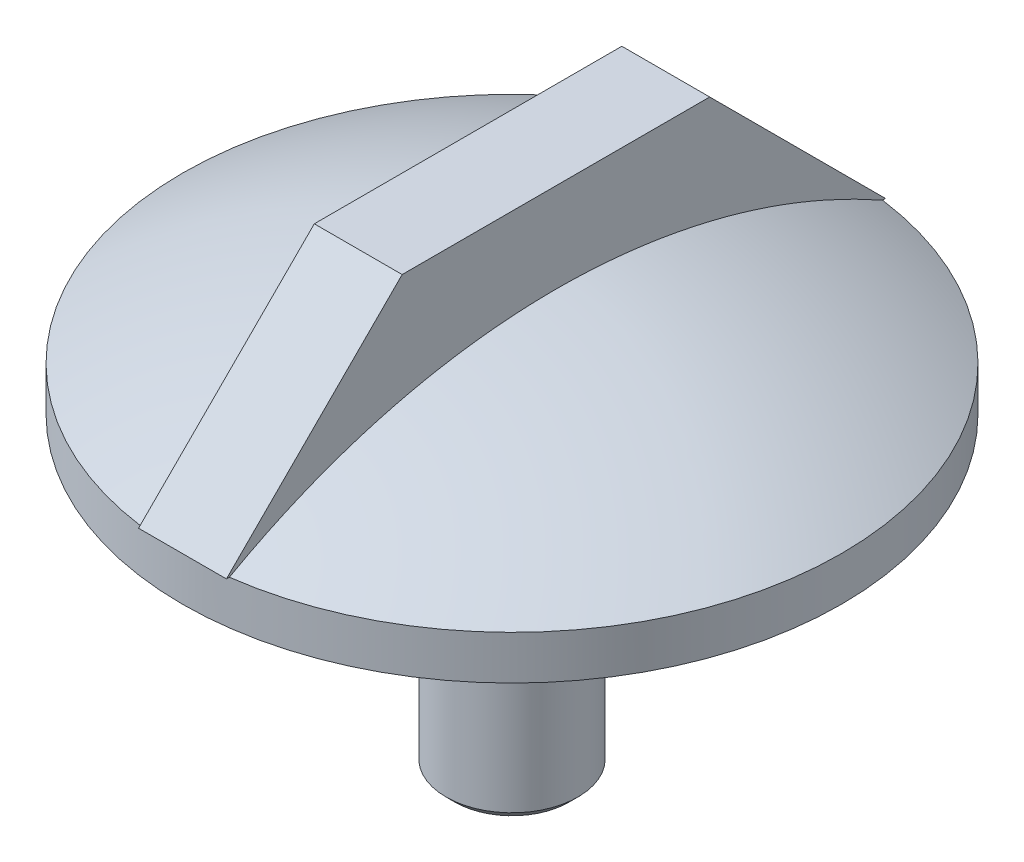
ISO-10303-21;
HEADER;
FILE_DESCRIPTION(('STEP AP214'),'2;1');
FILE_NAME('part.step','',(''),(''),'','','');
FILE_SCHEMA(('AUTOMOTIVE_DESIGN { 1 0 10303 214 1 1 1 1 }'));
ENDSEC;
DATA;
#1=APPLICATION_CONTEXT('core data for automotive mechanical design processes');
#2=APPLICATION_PROTOCOL_DEFINITION('international standard','automotive_design',2000,#1);
#3=PRODUCT_CONTEXT('',#1,'mechanical');
#4=PRODUCT('Part','Part','',(#3));
#5=PRODUCT_RELATED_PRODUCT_CATEGORY('part','',(#4));
#6=PRODUCT_DEFINITION_FORMATION('','',#4);
#7=PRODUCT_DEFINITION_CONTEXT('part definition',#1,'design');
#8=PRODUCT_DEFINITION('design','',#6,#7);
#9=PRODUCT_DEFINITION_SHAPE('','',#8);
#10=(LENGTH_UNIT() NAMED_UNIT(*) SI_UNIT(.MILLI.,.METRE.));
#11=(NAMED_UNIT(*) PLANE_ANGLE_UNIT() SI_UNIT($,.RADIAN.));
#12=(NAMED_UNIT(*) SI_UNIT($,.STERADIAN.) SOLID_ANGLE_UNIT());
#13=UNCERTAINTY_MEASURE_WITH_UNIT(LENGTH_MEASURE(1.E-05),#10,'distance_accuracy_value','');
#14=(GEOMETRIC_REPRESENTATION_CONTEXT(3) GLOBAL_UNCERTAINTY_ASSIGNED_CONTEXT((#13)) GLOBAL_UNIT_ASSIGNED_CONTEXT((#10,
#11,#12)) REPRESENTATION_CONTEXT('',''));
#15=CARTESIAN_POINT('',(0.,0.,0.));
#16=DIRECTION('',(0.,0.,1.));
#17=DIRECTION('',(1.,0.,0.));
#18=AXIS2_PLACEMENT_3D('',#15,#16,#17);
#19=CARTESIAN_POINT('',(7.49999999999998,1.,0.));
#20=CARTESIAN_POINT('',(4.01502537335899,2.96753451753274,-1.11022302462516E-13));
#21=CARTESIAN_POINT('',(0.,3.,0.));
#22=B_SPLINE_CURVE_WITH_KNOTS('',2,(#19,#20,#21),.UNSPECIFIED.,.F.,.F.,(3,3),(0.,1.),.UNSPECIFIED.);
#23=CARTESIAN_POINT('',(0.,1.,0.));
#24=DIRECTION('',(0.,-1.,0.));
#25=AXIS1_PLACEMENT('',#23,#24);
#26=SURFACE_OF_REVOLUTION('',#22,#25);
#27=CARTESIAN_POINT('',(0.,1.,0.));
#28=DIRECTION('',(0.,1.,0.));
#29=DIRECTION('',(0.,0.,0.999999999999999));
#30=AXIS2_PLACEMENT_3D('',#27,#28,#29);
#31=CIRCLE('',#30,7.5);
#32=CARTESIAN_POINT('',(1.,1.,7.43303437365922));
#33=VERTEX_POINT('',#32);
#34=CARTESIAN_POINT('',(1.,1.,-7.43303437365933));
#35=VERTEX_POINT('',#34);
#36=EDGE_CURVE('E216',#33,#35,#31,.T.);
#37=ORIENTED_EDGE('',*,*,#36,.T.);
#38=CARTESIAN_POINT('',(1.,1.,-7.43303437365933));
#39=CARTESIAN_POINT('',(1.,1.12483932836674,-7.20995735723141));
#40=CARTESIAN_POINT('',(1.,1.24444428124756,-6.98393308758568));
#41=CARTESIAN_POINT('',(1.,1.47262415679961,-6.5263844530835));
#42=CARTESIAN_POINT('',(1.,1.58119898909355,-6.29486004317985));
#43=CARTESIAN_POINT('',(1.,1.78693917127141,-5.82629039901203));
#44=CARTESIAN_POINT('',(1.,1.88408375968663,-5.58923602803384));
#45=CARTESIAN_POINT('',(1.,2.0662791962518,-5.11052230813791));
#46=CARTESIAN_POINT('',(1.,2.15132941996455,-4.86886272218091));
#47=CARTESIAN_POINT('',(1.,2.3510061882268,-4.25152040223825));
#48=CARTESIAN_POINT('',(1.,2.45722353910996,-3.87307950893212));
#49=CARTESIAN_POINT('',(1.,2.63960187549855,-3.10892602747556));
#50=CARTESIAN_POINT('',(1.,2.71575297634149,-2.72321109148539));
#51=CARTESIAN_POINT('',(1.,2.83791386529063,-1.94699714541732));
#52=CARTESIAN_POINT('',(1.,2.88391935522713,-1.55649746121097));
#53=CARTESIAN_POINT('',(1.,2.94579054653531,-0.773157140391238));
#54=CARTESIAN_POINT('',(1.,2.96166248652454,-0.380317005224834));
#55=CARTESIAN_POINT('',(1.,2.96099274938101,0.405380721330795));
#56=CARTESIAN_POINT('',(1.,2.94444728502722,0.79823830939718));
#57=CARTESIAN_POINT('',(1.,2.88126057539498,1.58156634689101));
#58=CARTESIAN_POINT('',(1.00000000000001,2.83461307980654,1.97203628355114));
#59=CARTESIAN_POINT('',(0.999999999999996,2.71114919949951,2.74813484363986));
#60=CARTESIAN_POINT('',(0.999999999999983,2.63433727736462,3.13376417449233));
#61=CARTESIAN_POINT('',(1.00000000000002,2.4506418890203,3.89769219731147));
#62=CARTESIAN_POINT('',(1.00000000000007,2.34376838861548,4.27599327434062));
#63=CARTESIAN_POINT('',(1.00000000000005,2.1436892899011,4.8910106566817));
#64=CARTESIAN_POINT('',(1.00000000000001,2.0589922496674,5.13053430523275));
#65=CARTESIAN_POINT('',(0.999999999999988,1.87771398030631,5.60503916543916));
#66=CARTESIAN_POINT('',(0.999999999999997,1.78113337350886,5.84002061421968));
#67=CARTESIAN_POINT('',(1.,1.57672278774387,6.30452183507819));
#68=CARTESIAN_POINT('',(1.,1.46891338652087,6.53405068318347));
#69=CARTESIAN_POINT('',(0.999999999999999,1.2424516731923,6.98769706953818));
#70=CARTESIAN_POINT('',(0.999999999999997,1.12379941222688,7.21181463330354));
#71=CARTESIAN_POINT('',(1.,1.,7.43303437365922));
#72=B_SPLINE_CURVE_WITH_KNOTS('',3,(#38,#39,#40,#41,#42,#43,#44,#45,#46,#47,#48,#49,#50,#51,#52,
#53,#54,#55,#56,#57,#58,#59,#60,#61,#62,#63,#64,#65,#66,#67,#68,#69,#70,#71),.UNSPECIFIED.,.F.,
.F.,(4,2,2,2,2,2,2,2,2,2,2,2,2,2,2,2,4),(0.,0.766851037742644,1.53370835831071,2.30193774318379,
3.07020677767693,4.24810829910486,5.42639674883922,6.60485316273854,7.78306557150267,
8.96141563523786,10.1400104473741,11.318430961558,12.4964612734932,13.2583433361264,
14.0201855167623,14.7806553334595,15.5411215635997),.UNSPECIFIED.);
#73=EDGE_CURVE('E172',#35,#33,#72,.T.);
#74=ORIENTED_EDGE('',*,*,#73,.T.);
#75=EDGE_LOOP('',(#37,#74));
#76=FACE_BOUND('',#75,.T.);
#77=ADVANCED_FACE('F44',(#76),#26,.F.);
#78=CARTESIAN_POINT('',(0.,1.,0.));
#79=DIRECTION('',(0.,-1.,0.));
#80=DIRECTION('',(0.,0.,-0.999999999999999));
#81=AXIS2_PLACEMENT_3D('',#78,#79,#80);
#82=CYLINDRICAL_SURFACE('',#81,7.5);
#83=CARTESIAN_POINT('',(0.,1.,7.50000000000001));
#84=VERTEX_POINT('',#83);
#85=EDGE_CURVE('E116',#84,#33,#31,.T.);
#86=ORIENTED_EDGE('',*,*,#85,.F.);
#87=CARTESIAN_POINT('',(-0.999999999999945,1.,7.43303437365916));
#88=VERTEX_POINT('',#87);
#89=EDGE_CURVE('E68',#88,#84,#31,.T.);
#90=ORIENTED_EDGE('',*,*,#89,.F.);
#91=CARTESIAN_POINT('',(-0.999999999999945,1.,-7.43303437365928));
#92=VERTEX_POINT('',#91);
#93=EDGE_CURVE('E222',#92,#88,#31,.T.);
#94=ORIENTED_EDGE('',*,*,#93,.F.);
#95=CARTESIAN_POINT('',(0.,1.,-7.50000000000001));
#96=VERTEX_POINT('',#95);
#97=EDGE_CURVE('E219',#96,#92,#31,.T.);
#98=ORIENTED_EDGE('',*,*,#97,.F.);
#99=EDGE_CURVE('E218',#35,#96,#31,.T.);
#100=ORIENTED_EDGE('',*,*,#99,.F.);
#101=ORIENTED_EDGE('',*,*,#36,.F.);
#102=EDGE_LOOP('',(#86,#90,#94,#98,#100,#101));
#103=FACE_BOUND('',#102,.T.);
#104=CARTESIAN_POINT('',(0.,0.,0.));
#105=DIRECTION('',(0.,1.,0.));
#106=DIRECTION('',(0.,0.,0.999999999999999));
#107=AXIS2_PLACEMENT_3D('',#104,#105,#106);
#108=CIRCLE('',#107,7.5);
#109=CARTESIAN_POINT('',(0.,0.,7.49999999999999));
#110=VERTEX_POINT('',#109);
#111=EDGE_CURVE('E145',#110,#110,#108,.T.);
#112=ORIENTED_EDGE('',*,*,#111,.T.);
#113=EDGE_LOOP('',(#112));
#114=FACE_BOUND('',#113,.T.);
#115=ADVANCED_FACE('F208',(#103,#114),#82,.T.);
#116=CARTESIAN_POINT('',(0.,0.,0.));
#117=DIRECTION('',(0.,1.,0.));
#118=DIRECTION('',(0.,0.,0.999999999999999));
#119=AXIS2_PLACEMENT_3D('',#116,#117,#118);
#120=PLANE('',#119);
#121=CARTESIAN_POINT('',(0.,0.,0.));
#122=DIRECTION('',(0.,-1.,0.));
#123=DIRECTION('',(0.,0.,-0.999999999999999));
#124=AXIS2_PLACEMENT_3D('',#121,#122,#123);
#125=CIRCLE('',#124,1.5);
#126=CARTESIAN_POINT('',(0.,0.,1.5));
#127=VERTEX_POINT('',#126);
#128=EDGE_CURVE('E129',#127,#127,#125,.T.);
#129=ORIENTED_EDGE('',*,*,#128,.F.);
#130=EDGE_LOOP('',(#129));
#131=FACE_BOUND('',#130,.T.);
#132=ORIENTED_EDGE('',*,*,#111,.F.);
#133=EDGE_LOOP('',(#132));
#134=FACE_BOUND('',#133,.T.);
#135=ADVANCED_FACE('F167',(#131,#134),#120,.F.);
#136=CARTESIAN_POINT('',(-0.999999999999945,1.,-7.43303437365928));
#137=CARTESIAN_POINT('',(-0.999999999999981,1.12483932836676,-7.20995735723136));
#138=CARTESIAN_POINT('',(-0.999999999999995,1.24444428124759,-6.98393308758562));
#139=CARTESIAN_POINT('',(-1.00000000000001,1.47262415679964,-6.52638445308344));
#140=CARTESIAN_POINT('',(-1.,1.58119898909358,-6.29486004317978));
#141=CARTESIAN_POINT('',(-0.999999999999999,1.78693917127144,-5.82629039901196));
#142=CARTESIAN_POINT('',(-1.,1.88408375968667,-5.58923602803376));
#143=CARTESIAN_POINT('',(-1.,2.06627919625182,-5.11052230813782));
#144=CARTESIAN_POINT('',(-1.,2.15132941996456,-4.86886272218081));
#145=CARTESIAN_POINT('',(-1.,2.35100618822678,-4.25152040223815));
#146=CARTESIAN_POINT('',(-1.,2.45722353910997,-3.87307950893205));
#147=CARTESIAN_POINT('',(-1.,2.63960187549856,-3.10892602747555));
#148=CARTESIAN_POINT('',(-0.999999999999997,2.71575297634149,-2.72321109148539));
#149=CARTESIAN_POINT('',(-1.,2.83791386529062,-1.94699714541737));
#150=CARTESIAN_POINT('',(-1.00000000000002,2.88391935522712,-1.55649746121104));
#151=CARTESIAN_POINT('',(-0.999999999999986,2.9457905465353,-0.773157140391359));
#152=CARTESIAN_POINT('',(-0.999999999999946,2.96166248652454,-0.380317005224978));
#153=CARTESIAN_POINT('',(-0.999999999999945,2.96099274938101,0.405380721330643));
#154=CARTESIAN_POINT('',(-0.999999999999985,2.94444728502723,0.798238309397041));
#155=CARTESIAN_POINT('',(-1.00000000000002,2.88126057539499,1.5815663468909));
#156=CARTESIAN_POINT('',(-1.00000000000001,2.83461307980655,1.97203628355105));
#157=CARTESIAN_POINT('',(-0.999999999999994,2.71114919949952,2.74813484363979));
#158=CARTESIAN_POINT('',(-0.999999999999991,2.63433727736463,3.13376417449227));
#159=CARTESIAN_POINT('',(-1.00000000000001,2.4506418890203,3.89769219731145));
#160=CARTESIAN_POINT('',(-1.00000000000004,2.34376838861548,4.27599327434061));
#161=CARTESIAN_POINT('',(-1.00000000000002,2.1436892899011,4.89101065668169));
#162=CARTESIAN_POINT('',(-1.00000000000001,2.0589922496674,5.13053430523274));
#163=CARTESIAN_POINT('',(-0.999999999999994,1.87771398030632,5.60503916543914));
#164=CARTESIAN_POINT('',(-0.999999999999998,1.78113337350886,5.84002061421966));
#165=CARTESIAN_POINT('',(-1.,1.57672278774388,6.30452183507816));
#166=CARTESIAN_POINT('',(-1.00000000000001,1.46891338652088,6.53405068318344));
#167=CARTESIAN_POINT('',(-0.999999999999995,1.24245167319231,6.98769706953815));
#168=CARTESIAN_POINT('',(-0.999999999999979,1.12379941222689,7.2118146333035));
#169=CARTESIAN_POINT('',(-0.999999999999945,1.,7.43303437365916));
#170=B_SPLINE_CURVE_WITH_KNOTS('',3,(#136,#137,#138,#139,#140,#141,#142,#143,#144,#145,#146,
#147,#148,#149,#150,#151,#152,#153,#154,#155,#156,#157,#158,#159,#160,#161,#162,#163,#164,#165,
#166,#167,#168,#169),.UNSPECIFIED.,.F.,.F.,(4,2,2,2,2,2,2,2,2,2,2,2,2,2,2,2,4),(0.,
0.766851037742659,1.53370835831074,2.30193774318384,3.07020677767699,4.24810829910485,
5.42639674883914,6.60485316273839,7.78306557150245,8.96141563523768,10.140010447374,
11.3184309615579,12.4964612734931,13.2583433361264,14.0201855167622,14.7806553334594,
15.5411215635996),.UNSPECIFIED.);
#171=EDGE_CURVE('E179',#92,#88,#170,.T.);
#172=ORIENTED_EDGE('',*,*,#171,.F.);
#173=ORIENTED_EDGE('',*,*,#93,.T.);
#174=EDGE_LOOP('',(#172,#173));
#175=FACE_BOUND('',#174,.T.);
#176=ADVANCED_FACE('F161',(#175),#26,.F.);
#177=CARTESIAN_POINT('',(-1.,1.,-7.50000000000001));
#178=DIRECTION('',(0.,-1.,0.));
#179=DIRECTION('',(0.,0.,-0.999999999999999));
#180=AXIS2_PLACEMENT_3D('',#177,#178,#179);
#181=PLANE('',#180);
#182=DIRECTION('',(0.,0.,-0.999999999999999));
#183=VECTOR('',#182,1.);
#184=CARTESIAN_POINT('',(1.,1.,7.4999999999999));
#185=LINE('',#184,#183);
#186=CARTESIAN_POINT('',(1.,1.,-7.50000000000001));
#187=VERTEX_POINT('',#186);
#188=EDGE_CURVE('E119',#35,#187,#185,.T.);
#189=ORIENTED_EDGE('',*,*,#188,.F.);
#190=ORIENTED_EDGE('',*,*,#99,.T.);
#191=DIRECTION('',(1.,0.,0.));
#192=VECTOR('',#191,1.);
#193=CARTESIAN_POINT('',(-1.,1.,-7.50000000000001));
#194=LINE('',#193,#192);
#195=EDGE_CURVE('E150',#96,#187,#194,.T.);
#196=ORIENTED_EDGE('',*,*,#195,.T.);
#197=EDGE_LOOP('',(#189,#190,#196));
#198=FACE_BOUND('',#197,.T.);
#199=ADVANCED_FACE('F166',(#198),#181,.T.);
#200=CARTESIAN_POINT('',(-1.,1.,-7.50000000000001));
#201=VERTEX_POINT('',#200);
#202=EDGE_CURVE('E148',#201,#96,#194,.T.);
#203=ORIENTED_EDGE('',*,*,#202,.T.);
#204=ORIENTED_EDGE('',*,*,#97,.T.);
#205=DIRECTION('',(0.,0.,-0.999999999999999));
#206=VECTOR('',#205,1.);
#207=CARTESIAN_POINT('',(-0.999999999999945,1.,7.50000000000001));
#208=LINE('',#207,#206);
#209=EDGE_CURVE('E135',#92,#201,#208,.T.);
#210=ORIENTED_EDGE('',*,*,#209,.T.);
#211=EDGE_LOOP('',(#203,#204,#210));
#212=FACE_BOUND('',#211,.T.);
#213=ADVANCED_FACE('F204',(#212),#181,.T.);
#214=CARTESIAN_POINT('',(-0.999999999999945,1.,7.50000000000001));
#215=VERTEX_POINT('',#214);
#216=EDGE_CURVE('E136',#215,#88,#208,.T.);
#217=ORIENTED_EDGE('',*,*,#216,.T.);
#218=ORIENTED_EDGE('',*,*,#89,.T.);
#219=DIRECTION('',(1.,0.,0.));
#220=VECTOR('',#219,1.);
#221=CARTESIAN_POINT('',(-0.999999999999945,1.,7.50000000000001));
#222=LINE('',#221,#220);
#223=EDGE_CURVE('E110',#215,#84,#222,.T.);
#224=ORIENTED_EDGE('',*,*,#223,.F.);
#225=EDGE_LOOP('',(#217,#218,#224));
#226=FACE_BOUND('',#225,.T.);
#227=ADVANCED_FACE('F200',(#226),#181,.T.);
#228=CARTESIAN_POINT('',(-0.999999999999945,1.,7.50000000000001));
#229=DIRECTION('',(0.,0.707107710759315,0.707105851612558));
#230=DIRECTION('',(0.,-0.707105851612558,0.707107710759315));
#231=AXIS2_PLACEMENT_3D('',#228,#229,#230);
#232=PLANE('',#231);
#233=ORIENTED_EDGE('',*,*,#223,.T.);
#234=CARTESIAN_POINT('',(1.,1.,7.4999999999999));
#235=VERTEX_POINT('',#234);
#236=EDGE_CURVE('E106',#84,#235,#222,.T.);
#237=ORIENTED_EDGE('',*,*,#236,.T.);
#238=DIRECTION('',(0.,-0.707105851612558,0.707107710759314));
#239=VECTOR('',#238,1.);
#240=CARTESIAN_POINT('',(1.,1.,7.4999999999999));
#241=LINE('',#240,#239);
#242=CARTESIAN_POINT('',(1.,5.,3.49998948306385));
#243=VERTEX_POINT('',#242);
#244=EDGE_CURVE('E108',#243,#235,#241,.T.);
#245=ORIENTED_EDGE('',*,*,#244,.F.);
#246=DIRECTION('',(1.,0.,0.));
#247=VECTOR('',#246,1.);
#248=CARTESIAN_POINT('',(-1.,5.,3.49998948306396));
#249=LINE('',#248,#247);
#250=CARTESIAN_POINT('',(-1.,5.,3.49998948306396));
#251=VERTEX_POINT('',#250);
#252=EDGE_CURVE('E143',#251,#243,#249,.T.);
#253=ORIENTED_EDGE('',*,*,#252,.F.);
#254=DIRECTION('',(0.,-0.707105851612558,0.707107710759314));
#255=VECTOR('',#254,1.);
#256=CARTESIAN_POINT('',(-0.999999999999945,1.,7.50000000000001));
#257=LINE('',#256,#255);
#258=EDGE_CURVE('E133',#251,#215,#257,.T.);
#259=ORIENTED_EDGE('',*,*,#258,.T.);
#260=EDGE_LOOP('',(#233,#237,#245,#253,#259));
#261=FACE_BOUND('',#260,.T.);
#262=ADVANCED_FACE('F107',(#261),#232,.T.);
#263=CARTESIAN_POINT('',(-1.,5.,-3.5000105169084));
#264=DIRECTION('',(0.,1.,0.));
#265=DIRECTION('',(0.,0.,0.999999999999999));
#266=AXIS2_PLACEMENT_3D('',#263,#264,#265);
#267=PLANE('',#266);
#268=ORIENTED_EDGE('',*,*,#252,.T.);
#269=DIRECTION('',(0.,0.,0.999999999999999));
#270=VECTOR('',#269,1.);
#271=CARTESIAN_POINT('',(1.,5.,-3.5000105169084));
#272=LINE('',#271,#270);
#273=CARTESIAN_POINT('',(1.,5.,-3.5000105169084));
#274=VERTEX_POINT('',#273);
#275=EDGE_CURVE('E125',#274,#243,#272,.T.);
#276=ORIENTED_EDGE('',*,*,#275,.F.);
#277=DIRECTION('',(1.,0.,0.));
#278=VECTOR('',#277,1.);
#279=CARTESIAN_POINT('',(-1.,5.,-3.5000105169084));
#280=LINE('',#279,#278);
#281=CARTESIAN_POINT('',(-1.,5.,-3.5000105169084));
#282=VERTEX_POINT('',#281);
#283=EDGE_CURVE('E146',#282,#274,#280,.T.);
#284=ORIENTED_EDGE('',*,*,#283,.F.);
#285=DIRECTION('',(0.,0.,0.999999999999999));
#286=VECTOR('',#285,1.);
#287=CARTESIAN_POINT('',(-1.,5.,-3.5000105169084));
#288=LINE('',#287,#286);
#289=EDGE_CURVE('E113',#282,#251,#288,.T.);
#290=ORIENTED_EDGE('',*,*,#289,.T.);
#291=EDGE_LOOP('',(#268,#276,#284,#290));
#292=FACE_BOUND('',#291,.T.);
#293=ADVANCED_FACE('F192',(#292),#267,.T.);
#294=CARTESIAN_POINT('',(-1.,5.,-3.5000105169084));
#295=DIRECTION('',(0.,0.707105851612558,-0.707107710759314));
#296=DIRECTION('',(0.,0.707107710759314,0.707105851612558));
#297=AXIS2_PLACEMENT_3D('',#294,#295,#296);
#298=PLANE('',#297);
#299=ORIENTED_EDGE('',*,*,#283,.T.);
#300=DIRECTION('',(0.,0.707107710759314,0.707105851612558));
#301=VECTOR('',#300,1.);
#302=CARTESIAN_POINT('',(1.,5.,-3.5000105169084));
#303=LINE('',#302,#301);
#304=EDGE_CURVE('E118',#187,#274,#303,.T.);
#305=ORIENTED_EDGE('',*,*,#304,.F.);
#306=ORIENTED_EDGE('',*,*,#195,.F.);
#307=ORIENTED_EDGE('',*,*,#202,.F.);
#308=DIRECTION('',(0.,0.707107710759314,0.707105851612558));
#309=VECTOR('',#308,1.);
#310=CARTESIAN_POINT('',(-1.,5.,-3.5000105169084));
#311=LINE('',#310,#309);
#312=EDGE_CURVE('E138',#201,#282,#311,.T.);
#313=ORIENTED_EDGE('',*,*,#312,.T.);
#314=EDGE_LOOP('',(#299,#305,#306,#307,#313));
#315=FACE_BOUND('',#314,.T.);
#316=ADVANCED_FACE('F195',(#315),#298,.T.);
#317=ORIENTED_EDGE('',*,*,#236,.F.);
#318=ORIENTED_EDGE('',*,*,#85,.T.);
#319=EDGE_CURVE('E60',#235,#33,#185,.T.);
#320=ORIENTED_EDGE('',*,*,#319,.F.);
#321=EDGE_LOOP('',(#317,#318,#320));
#322=FACE_BOUND('',#321,.T.);
#323=ADVANCED_FACE('F115',(#322),#181,.T.);
#324=CARTESIAN_POINT('',(-1.,0.,0.));
#325=DIRECTION('',(-1.,0.,0.));
#326=DIRECTION('',(0.,0.,0.999999999999999));
#327=AXIS2_PLACEMENT_3D('',#324,#325,#326);
#328=PLANE('',#327);
#329=ORIENTED_EDGE('',*,*,#209,.F.);
#330=ORIENTED_EDGE('',*,*,#171,.T.);
#331=ORIENTED_EDGE('',*,*,#216,.F.);
#332=ORIENTED_EDGE('',*,*,#258,.F.);
#333=ORIENTED_EDGE('',*,*,#289,.F.);
#334=ORIENTED_EDGE('',*,*,#312,.F.);
#335=EDGE_LOOP('',(#329,#330,#331,#332,#333,#334));
#336=FACE_BOUND('',#335,.T.);
#337=ADVANCED_FACE('F185',(#336),#328,.T.);
#338=CARTESIAN_POINT('',(1.,0.,0.));
#339=DIRECTION('',(-1.,0.,0.));
#340=DIRECTION('',(0.,0.,0.999999999999999));
#341=AXIS2_PLACEMENT_3D('',#338,#339,#340);
#342=PLANE('',#341);
#343=ORIENTED_EDGE('',*,*,#73,.F.);
#344=ORIENTED_EDGE('',*,*,#188,.T.);
#345=ORIENTED_EDGE('',*,*,#304,.T.);
#346=ORIENTED_EDGE('',*,*,#275,.T.);
#347=ORIENTED_EDGE('',*,*,#244,.T.);
#348=ORIENTED_EDGE('',*,*,#319,.T.);
#349=EDGE_LOOP('',(#343,#344,#345,#346,#347,#348));
#350=FACE_BOUND('',#349,.T.);
#351=ADVANCED_FACE('F122',(#350),#342,.F.);
#352=CARTESIAN_POINT('',(0.,-7.,0.));
#353=DIRECTION('',(0.,1.,0.));
#354=DIRECTION('',(0.,0.,0.999999999999999));
#355=AXIS2_PLACEMENT_3D('',#352,#353,#354);
#356=CYLINDRICAL_SURFACE('',#355,1.5);
#357=CARTESIAN_POINT('',(0.,-6.8,0.));
#358=DIRECTION('',(0.,-1.,0.));
#359=DIRECTION('',(0.,0.,-0.999999999999999));
#360=AXIS2_PLACEMENT_3D('',#357,#358,#359);
#361=CIRCLE('',#360,1.5);
#362=CARTESIAN_POINT('',(0.,-6.8,1.5));
#363=VERTEX_POINT('',#362);
#364=EDGE_CURVE('E11',#363,#363,#361,.F.);
#365=CARTESIAN_POINT('',(0.,-6.8,1.5));
#366=CARTESIAN_POINT('',(0.,-6.72916666666666,1.5));
#367=CARTESIAN_POINT('',(0.,-6.65833333333333,1.5));
#368=CARTESIAN_POINT('',(0.,-6.51666666666666,1.5));
#369=CARTESIAN_POINT('',(0.,-6.44583333333333,1.5));
#370=CARTESIAN_POINT('',(0.,-6.30416666666666,1.5));
#371=CARTESIAN_POINT('',(0.,-6.23333333333333,1.5));
#372=CARTESIAN_POINT('',(0.,-6.09166666666666,1.5));
#373=CARTESIAN_POINT('',(0.,-6.02083333333333,1.5));
#374=CARTESIAN_POINT('',(0.,-5.87916666666666,1.5));
#375=CARTESIAN_POINT('',(0.,-5.80833333333333,1.5));
#376=CARTESIAN_POINT('',(0.,-5.66666666666666,1.5));
#377=CARTESIAN_POINT('',(0.,-5.59583333333333,1.5));
#378=CARTESIAN_POINT('',(0.,-5.45416666666667,1.5));
#379=CARTESIAN_POINT('',(0.,-5.38333333333333,1.5));
#380=CARTESIAN_POINT('',(0.,-5.24166666666666,1.5));
#381=CARTESIAN_POINT('',(0.,-5.17083333333333,1.5));
#382=CARTESIAN_POINT('',(0.,-5.02916666666667,1.5));
#383=CARTESIAN_POINT('',(0.,-4.95833333333333,1.5));
#384=CARTESIAN_POINT('',(0.,-4.81666666666666,1.5));
#385=CARTESIAN_POINT('',(0.,-4.74583333333333,1.5));
#386=CARTESIAN_POINT('',(0.,-4.60416666666667,1.5));
#387=CARTESIAN_POINT('',(0.,-4.53333333333333,1.5));
#388=CARTESIAN_POINT('',(0.,-4.39166666666667,1.5));
#389=CARTESIAN_POINT('',(0.,-4.32083333333333,1.5));
#390=CARTESIAN_POINT('',(0.,-4.17916666666667,1.5));
#391=CARTESIAN_POINT('',(0.,-4.10833333333333,1.5));
#392=CARTESIAN_POINT('',(0.,-3.96666666666667,1.5));
#393=CARTESIAN_POINT('',(0.,-3.89583333333333,1.5));
#394=CARTESIAN_POINT('',(0.,-3.75416666666667,1.5));
#395=CARTESIAN_POINT('',(0.,-3.68333333333333,1.5));
#396=CARTESIAN_POINT('',(0.,-3.54166666666667,1.5));
#397=CARTESIAN_POINT('',(0.,-3.47083333333333,1.5));
#398=CARTESIAN_POINT('',(0.,-3.32916666666667,1.5));
#399=CARTESIAN_POINT('',(0.,-3.25833333333333,1.5));
#400=CARTESIAN_POINT('',(0.,-3.11666666666667,1.5));
#401=CARTESIAN_POINT('',(0.,-3.04583333333333,1.5));
#402=CARTESIAN_POINT('',(0.,-2.90416666666667,1.5));
#403=CARTESIAN_POINT('',(0.,-2.83333333333333,1.5));
#404=CARTESIAN_POINT('',(0.,-2.69166666666667,1.5));
#405=CARTESIAN_POINT('',(0.,-2.62083333333333,1.5));
#406=CARTESIAN_POINT('',(0.,-2.47916666666667,1.5));
#407=CARTESIAN_POINT('',(0.,-2.40833333333333,1.5));
#408=CARTESIAN_POINT('',(0.,-2.26666666666667,1.5));
#409=CARTESIAN_POINT('',(0.,-2.19583333333333,1.5));
#410=CARTESIAN_POINT('',(0.,-2.05416666666667,1.5));
#411=CARTESIAN_POINT('',(0.,-1.98333333333333,1.5));
#412=CARTESIAN_POINT('',(0.,-1.84166666666667,1.5));
#413=CARTESIAN_POINT('',(0.,-1.77083333333333,1.5));
#414=CARTESIAN_POINT('',(0.,-1.62916666666667,1.5));
#415=CARTESIAN_POINT('',(0.,-1.55833333333333,1.5));
#416=CARTESIAN_POINT('',(0.,-1.41666666666667,1.5));
#417=CARTESIAN_POINT('',(0.,-1.34583333333333,1.5));
#418=CARTESIAN_POINT('',(0.,-1.20416666666667,1.5));
#419=CARTESIAN_POINT('',(0.,-1.13333333333333,1.5));
#420=CARTESIAN_POINT('',(0.,-0.991666666666667,1.5));
#421=CARTESIAN_POINT('',(0.,-0.920833333333333,1.5));
#422=CARTESIAN_POINT('',(0.,-0.779166666666667,1.5));
#423=CARTESIAN_POINT('',(0.,-0.708333333333333,1.5));
#424=CARTESIAN_POINT('',(0.,-0.566666666666667,1.5));
#425=CARTESIAN_POINT('',(0.,-0.495833333333333,1.5));
#426=CARTESIAN_POINT('',(0.,-0.354166666666667,1.5));
#427=CARTESIAN_POINT('',(0.,-0.283333333333333,1.5));
#428=CARTESIAN_POINT('',(0.,-0.141666666666667,1.5));
#429=CARTESIAN_POINT('',(0.,-0.0708333333333339,1.5));
#430=CARTESIAN_POINT('',(0.,0.,1.5));
#431=B_SPLINE_CURVE_WITH_KNOTS('',3,(#365,#366,#367,#368,#369,#370,#371,#372,#373,#374,#375,
#376,#377,#378,#379,#380,#381,#382,#383,#384,#385,#386,#387,#388,#389,#390,#391,#392,#393,#394,
#395,#396,#397,#398,#399,#400,#401,#402,#403,#404,#405,#406,#407,#408,#409,#410,#411,#412,#413,
#414,#415,#416,#417,#418,#419,#420,#421,#422,#423,#424,#425,#426,#427,#428,#429,#430),
.UNSPECIFIED.,.F.,.F.,(4,2,2,2,2,2,2,2,2,2,2,2,2,2,2,2,2,2,2,2,2,2,2,2,2,2,2,2,2,2,2,2,4),(0.,
0.2125,0.425,0.6375,0.85,1.0625,1.275,1.4875,1.7,1.9125,2.125,2.3375,2.55,2.7625,2.975,3.1875,
3.4,3.6125,3.825,4.0375,4.25,4.4625,4.675,4.8875,5.1,5.3125,5.525,5.7375,5.95,6.1625,6.375,
6.5875,6.8),.UNSPECIFIED.);
#432=EDGE_CURVE('BSEAM250',#363,#127,#431,.T.);
#433=ORIENTED_EDGE('',*,*,#364,.T.);
#434=ORIENTED_EDGE('',*,*,#128,.T.);
#435=ORIENTED_EDGE('',*,*,#432,.T.);
#436=ORIENTED_EDGE('',*,*,#432,.F.);
#437=EDGE_LOOP('',(#433,#435,#434,#436));
#438=FACE_BOUND('',#437,.T.);
#439=ADVANCED_FACE('F250',(#438),#356,.T.);
#440=CARTESIAN_POINT('',(0.,-7.,0.));
#441=DIRECTION('',(0.,-1.,0.));
#442=DIRECTION('',(0.,0.,-0.999999999999999));
#443=AXIS2_PLACEMENT_3D('',#440,#441,#442);
#444=PLANE('',#443);
#445=CARTESIAN_POINT('',(0.,-7.,0.));
#446=DIRECTION('',(0.,-1.,0.));
#447=DIRECTION('',(0.,0.,-0.999999999999999));
#448=AXIS2_PLACEMENT_3D('',#445,#446,#447);
#449=CIRCLE('',#448,1.3);
#450=CARTESIAN_POINT('',(0.,-7.,1.3));
#451=VERTEX_POINT('',#450);
#452=EDGE_CURVE('E53',#451,#451,#449,.T.);
#453=ORIENTED_EDGE('',*,*,#452,.T.);
#454=EDGE_LOOP('',(#453));
#455=FACE_BOUND('',#454,.T.);
#456=ADVANCED_FACE('F243',(#455),#444,.T.);
#457=CARTESIAN_POINT('',(0.,-7.,0.));
#458=DIRECTION('',(0.,1.,0.));
#459=DIRECTION('',(0.,0.,0.999999999999999));
#460=AXIS2_PLACEMENT_3D('',#457,#458,#459);
#461=CONICAL_SURFACE('',#460,1.3,0.785398163397446);
#462=CARTESIAN_POINT('',(0.,-6.8,1.5));
#463=CARTESIAN_POINT('',(0.,-6.80208333333333,1.49791666666667));
#464=CARTESIAN_POINT('',(0.,-6.80416666666666,1.49583333333333));
#465=CARTESIAN_POINT('',(0.,-6.80833333333333,1.49166666666667));
#466=CARTESIAN_POINT('',(0.,-6.81041666666666,1.48958333333333));
#467=CARTESIAN_POINT('',(0.,-6.81458333333333,1.48541666666667));
#468=CARTESIAN_POINT('',(0.,-6.81666666666666,1.48333333333333));
#469=CARTESIAN_POINT('',(0.,-6.82083333333333,1.47916666666667));
#470=CARTESIAN_POINT('',(0.,-6.82291666666666,1.47708333333333));
#471=CARTESIAN_POINT('',(0.,-6.82708333333333,1.47291666666667));
#472=CARTESIAN_POINT('',(0.,-6.82916666666666,1.47083333333333));
#473=CARTESIAN_POINT('',(0.,-6.83333333333333,1.46666666666667));
#474=CARTESIAN_POINT('',(0.,-6.83541666666666,1.46458333333333));
#475=CARTESIAN_POINT('',(0.,-6.83958333333333,1.46041666666667));
#476=CARTESIAN_POINT('',(0.,-6.84166666666666,1.45833333333333));
#477=CARTESIAN_POINT('',(0.,-6.84583333333333,1.45416666666667));
#478=CARTESIAN_POINT('',(0.,-6.84791666666666,1.45208333333333));
#479=CARTESIAN_POINT('',(0.,-6.85208333333333,1.44791666666667));
#480=CARTESIAN_POINT('',(0.,-6.85416666666666,1.44583333333333));
#481=CARTESIAN_POINT('',(0.,-6.85833333333333,1.44166666666667));
#482=CARTESIAN_POINT('',(0.,-6.86041666666666,1.43958333333333));
#483=CARTESIAN_POINT('',(0.,-6.86458333333333,1.43541666666667));
#484=CARTESIAN_POINT('',(0.,-6.86666666666666,1.43333333333333));
#485=CARTESIAN_POINT('',(0.,-6.87083333333333,1.42916666666667));
#486=CARTESIAN_POINT('',(0.,-6.87291666666666,1.42708333333333));
#487=CARTESIAN_POINT('',(0.,-6.87708333333333,1.42291666666667));
#488=CARTESIAN_POINT('',(0.,-6.87916666666666,1.42083333333333));
#489=CARTESIAN_POINT('',(0.,-6.88333333333333,1.41666666666667));
#490=CARTESIAN_POINT('',(0.,-6.88541666666666,1.41458333333333));
#491=CARTESIAN_POINT('',(0.,-6.88958333333333,1.41041666666667));
#492=CARTESIAN_POINT('',(0.,-6.89166666666666,1.40833333333333));
#493=CARTESIAN_POINT('',(0.,-6.89583333333333,1.40416666666667));
#494=CARTESIAN_POINT('',(0.,-6.89791666666666,1.40208333333333));
#495=CARTESIAN_POINT('',(0.,-6.90208333333333,1.39791666666667));
#496=CARTESIAN_POINT('',(0.,-6.90416666666666,1.39583333333333));
#497=CARTESIAN_POINT('',(0.,-6.90833333333333,1.39166666666667));
#498=CARTESIAN_POINT('',(0.,-6.91041666666666,1.38958333333333));
#499=CARTESIAN_POINT('',(0.,-6.91458333333333,1.38541666666667));
#500=CARTESIAN_POINT('',(0.,-6.91666666666666,1.38333333333333));
#501=CARTESIAN_POINT('',(0.,-6.92083333333333,1.37916666666667));
#502=CARTESIAN_POINT('',(0.,-6.92291666666666,1.37708333333333));
#503=CARTESIAN_POINT('',(0.,-6.92708333333333,1.37291666666667));
#504=CARTESIAN_POINT('',(0.,-6.92916666666666,1.37083333333333));
#505=CARTESIAN_POINT('',(0.,-6.93333333333333,1.36666666666667));
#506=CARTESIAN_POINT('',(0.,-6.93541666666666,1.36458333333333));
#507=CARTESIAN_POINT('',(0.,-6.93958333333333,1.36041666666667));
#508=CARTESIAN_POINT('',(0.,-6.94166666666666,1.35833333333333));
#509=CARTESIAN_POINT('',(0.,-6.94583333333333,1.35416666666667));
#510=CARTESIAN_POINT('',(0.,-6.94791666666666,1.35208333333333));
#511=CARTESIAN_POINT('',(0.,-6.95208333333333,1.34791666666667));
#512=CARTESIAN_POINT('',(0.,-6.95416666666666,1.34583333333333));
#513=CARTESIAN_POINT('',(0.,-6.95833333333333,1.34166666666667));
#514=CARTESIAN_POINT('',(0.,-6.96041666666666,1.33958333333333));
#515=CARTESIAN_POINT('',(0.,-6.96458333333333,1.33541666666667));
#516=CARTESIAN_POINT('',(0.,-6.96666666666666,1.33333333333334));
#517=CARTESIAN_POINT('',(0.,-6.97083333333333,1.32916666666667));
#518=CARTESIAN_POINT('',(0.,-6.97291666666666,1.32708333333334));
#519=CARTESIAN_POINT('',(0.,-6.97708333333333,1.32291666666667));
#520=CARTESIAN_POINT('',(0.,-6.97916666666666,1.32083333333334));
#521=CARTESIAN_POINT('',(0.,-6.98333333333333,1.31666666666667));
#522=CARTESIAN_POINT('',(0.,-6.98541666666666,1.31458333333334));
#523=CARTESIAN_POINT('',(0.,-6.98958333333333,1.31041666666667));
#524=CARTESIAN_POINT('',(0.,-6.99166666666666,1.30833333333334));
#525=CARTESIAN_POINT('',(0.,-6.99583333333333,1.30416666666667));
#526=CARTESIAN_POINT('',(0.,-6.99791666666666,1.30208333333334));
#527=CARTESIAN_POINT('',(0.,-7.,1.3));
#528=B_SPLINE_CURVE_WITH_KNOTS('',3,(#462,#463,#464,#465,#466,#467,#468,#469,#470,#471,#472,
#473,#474,#475,#476,#477,#478,#479,#480,#481,#482,#483,#484,#485,#486,#487,#488,#489,#490,#491,
#492,#493,#494,#495,#496,#497,#498,#499,#500,#501,#502,#503,#504,#505,#506,#507,#508,#509,#510,
#511,#512,#513,#514,#515,#516,#517,#518,#519,#520,#521,#522,#523,#524,#525,#526,#527),
.UNSPECIFIED.,.F.,.F.,(4,2,2,2,2,2,2,2,2,2,2,2,2,2,2,2,2,2,2,2,2,2,2,2,2,2,2,2,2,2,2,2,4),(0.,
0.00883883476483133,0.0176776695296631,0.0265165042944951,0.035355339059327,0.0441941738241583,
0.0530330085889901,0.0618718433538221,0.0707106781186533,0.0795495128834852,0.0883883476483171,
0.0972271824131491,0.106066017177981,0.114904851942812,0.123743686707644,0.132582521472476,
0.141421356237308,0.150260191002139,0.159099025766971,0.167937860531803,0.176776695296635,
0.185615530061466,0.194454364826298,0.20329319959113,0.212132034355962,0.220970869120794,
0.229809703885625,0.238648538650457,0.247487373415289,0.256326208180121,0.265165042944952,
0.274003877709784,0.282842712474616),.UNSPECIFIED.);
#529=EDGE_CURVE('BSEAM47',#363,#451,#528,.T.);
#530=ORIENTED_EDGE('',*,*,#364,.F.);
#531=ORIENTED_EDGE('',*,*,#452,.F.);
#532=ORIENTED_EDGE('',*,*,#529,.T.);
#533=ORIENTED_EDGE('',*,*,#529,.F.);
#534=EDGE_LOOP('',(#530,#532,#531,#533));
#535=FACE_BOUND('',#534,.T.);
#536=ADVANCED_FACE('F47',(#535),#461,.T.);
#537=CLOSED_SHELL('',(#77,#115,#135,#176,#199,#213,#227,#262,#293,#316,#323,#337,#351,#439,#456,#536));
#538=MANIFOLD_SOLID_BREP('B2',#537);
#539=ADVANCED_BREP_SHAPE_REPRESENTATION('',(#18,#538),#14);
#540=SHAPE_DEFINITION_REPRESENTATION(#9,#539);
ENDSEC;
END-ISO-10303-21;
